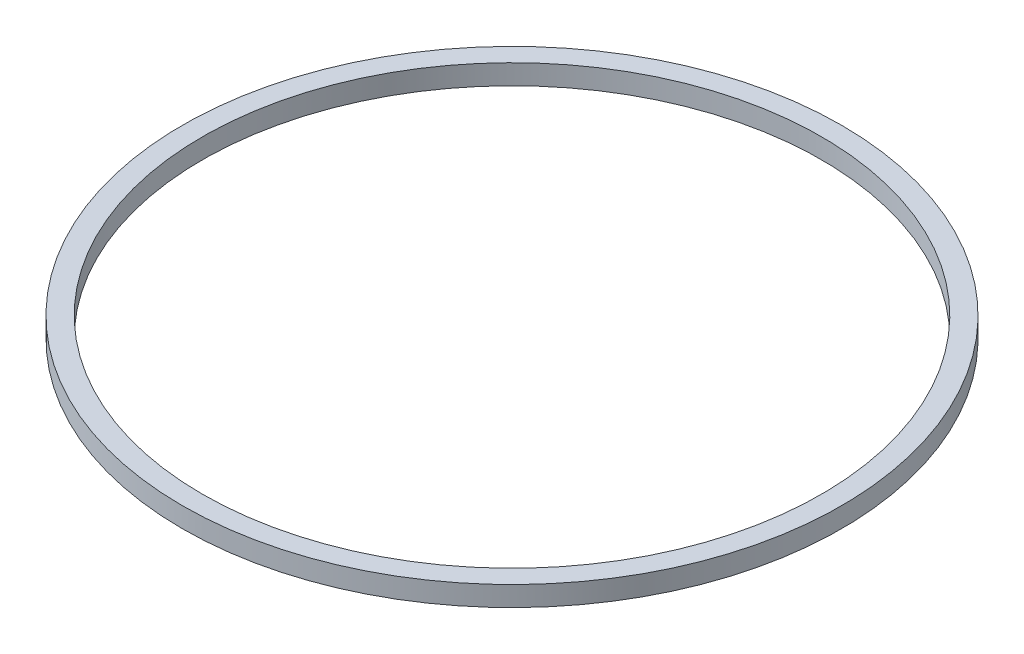
ISO-10303-21;
HEADER;
FILE_DESCRIPTION(('STEP AP214'),'2;1');
FILE_NAME('part.step','',(''),(''),'','','');
FILE_SCHEMA(('AUTOMOTIVE_DESIGN { 1 0 10303 214 1 1 1 1 }'));
ENDSEC;
DATA;
#1=APPLICATION_CONTEXT('core data for automotive mechanical design processes');
#2=APPLICATION_PROTOCOL_DEFINITION('international standard','automotive_design',2000,#1);
#3=PRODUCT_CONTEXT('',#1,'mechanical');
#4=PRODUCT('Part','Part','',(#3));
#5=PRODUCT_RELATED_PRODUCT_CATEGORY('part','',(#4));
#6=PRODUCT_DEFINITION_FORMATION('','',#4);
#7=PRODUCT_DEFINITION_CONTEXT('part definition',#1,'design');
#8=PRODUCT_DEFINITION('design','',#6,#7);
#9=PRODUCT_DEFINITION_SHAPE('','',#8);
#10=(LENGTH_UNIT() NAMED_UNIT(*) SI_UNIT(.MILLI.,.METRE.));
#11=(NAMED_UNIT(*) PLANE_ANGLE_UNIT() SI_UNIT($,.RADIAN.));
#12=(NAMED_UNIT(*) SI_UNIT($,.STERADIAN.) SOLID_ANGLE_UNIT());
#13=UNCERTAINTY_MEASURE_WITH_UNIT(LENGTH_MEASURE(1.E-05),#10,'distance_accuracy_value','');
#14=(GEOMETRIC_REPRESENTATION_CONTEXT(3) GLOBAL_UNCERTAINTY_ASSIGNED_CONTEXT((#13)) GLOBAL_UNIT_ASSIGNED_CONTEXT((#10,
#11,#12)) REPRESENTATION_CONTEXT('',''));
#15=CARTESIAN_POINT('',(0.,0.,0.));
#16=DIRECTION('',(0.,0.,1.));
#17=DIRECTION('',(1.,0.,0.));
#18=AXIS2_PLACEMENT_3D('',#15,#16,#17);
#19=CARTESIAN_POINT('',(0.,2.,0.));
#20=DIRECTION('',(0.,1.,0.));
#21=DIRECTION('',(0.,0.,1.));
#22=AXIS2_PLACEMENT_3D('',#19,#20,#21);
#23=PLANE('',#22);
#24=CARTESIAN_POINT('',(0.,2.,0.));
#25=DIRECTION('',(0.,1.,0.));
#26=DIRECTION('',(0.,0.,1.));
#27=AXIS2_PLACEMENT_3D('',#24,#25,#26);
#28=CIRCLE('',#27,33.);
#29=CARTESIAN_POINT('',(0.,2.,33.));
#30=VERTEX_POINT('',#29);
#31=EDGE_CURVE('E10',#30,#30,#28,.T.);
#32=ORIENTED_EDGE('',*,*,#31,.T.);
#33=EDGE_LOOP('',(#32));
#34=FACE_BOUND('',#33,.T.);
#35=CARTESIAN_POINT('',(0.,2.,0.));
#36=DIRECTION('',(0.,1.,0.));
#37=DIRECTION('',(0.,0.,1.));
#38=AXIS2_PLACEMENT_3D('',#35,#36,#37);
#39=CIRCLE('',#38,31.);
#40=CARTESIAN_POINT('',(0.,2.,31.));
#41=VERTEX_POINT('',#40);
#42=EDGE_CURVE('E44',#41,#41,#39,.T.);
#43=ORIENTED_EDGE('',*,*,#42,.F.);
#44=EDGE_LOOP('',(#43));
#45=FACE_BOUND('',#44,.T.);
#46=ADVANCED_FACE('F33',(#34,#45),#23,.T.);
#47=CARTESIAN_POINT('',(0.,0.,0.));
#48=DIRECTION('',(0.,1.,0.));
#49=DIRECTION('',(0.,0.,1.));
#50=AXIS2_PLACEMENT_3D('',#47,#48,#49);
#51=PLANE('',#50);
#52=CARTESIAN_POINT('',(0.,0.,0.));
#53=DIRECTION('',(0.,1.,0.));
#54=DIRECTION('',(0.,0.,1.));
#55=AXIS2_PLACEMENT_3D('',#52,#53,#54);
#56=CIRCLE('',#55,33.);
#57=CARTESIAN_POINT('',(0.,0.,33.));
#58=VERTEX_POINT('',#57);
#59=EDGE_CURVE('E37',#58,#58,#56,.T.);
#60=ORIENTED_EDGE('',*,*,#59,.F.);
#61=EDGE_LOOP('',(#60));
#62=FACE_BOUND('',#61,.T.);
#63=CARTESIAN_POINT('',(0.,0.,0.));
#64=DIRECTION('',(0.,1.,0.));
#65=DIRECTION('',(0.,0.,1.));
#66=AXIS2_PLACEMENT_3D('',#63,#64,#65);
#67=CIRCLE('',#66,31.);
#68=CARTESIAN_POINT('',(0.,0.,31.));
#69=VERTEX_POINT('',#68);
#70=EDGE_CURVE('E46',#69,#69,#67,.T.);
#71=ORIENTED_EDGE('',*,*,#70,.T.);
#72=EDGE_LOOP('',(#71));
#73=FACE_BOUND('',#72,.T.);
#74=ADVANCED_FACE('F56',(#62,#73),#51,.F.);
#75=CARTESIAN_POINT('',(0.,2.,0.));
#76=DIRECTION('',(0.,-1.,0.));
#77=DIRECTION('',(0.,0.,-1.));
#78=AXIS2_PLACEMENT_3D('',#75,#76,#77);
#79=CYLINDRICAL_SURFACE('',#78,33.);
#80=ORIENTED_EDGE('',*,*,#31,.F.);
#81=EDGE_LOOP('',(#80));
#82=FACE_BOUND('',#81,.T.);
#83=ORIENTED_EDGE('',*,*,#59,.T.);
#84=EDGE_LOOP('',(#83));
#85=FACE_BOUND('',#84,.T.);
#86=ADVANCED_FACE('F35',(#82,#85),#79,.T.);
#87=CARTESIAN_POINT('',(0.,2.,0.));
#88=DIRECTION('',(0.,-1.,0.));
#89=DIRECTION('',(0.,0.,-1.));
#90=AXIS2_PLACEMENT_3D('',#87,#88,#89);
#91=CYLINDRICAL_SURFACE('',#90,31.);
#92=ORIENTED_EDGE('',*,*,#42,.T.);
#93=EDGE_LOOP('',(#92));
#94=FACE_BOUND('',#93,.T.);
#95=ORIENTED_EDGE('',*,*,#70,.F.);
#96=EDGE_LOOP('',(#95));
#97=FACE_BOUND('',#96,.T.);
#98=ADVANCED_FACE('F52',(#94,#97),#91,.F.);
#99=CLOSED_SHELL('',(#46,#74,#86,#98));
#100=MANIFOLD_SOLID_BREP('B2',#99);
#101=ADVANCED_BREP_SHAPE_REPRESENTATION('',(#18,#100),#14);
#102=SHAPE_DEFINITION_REPRESENTATION(#9,#101);
ENDSEC;
END-ISO-10303-21;
